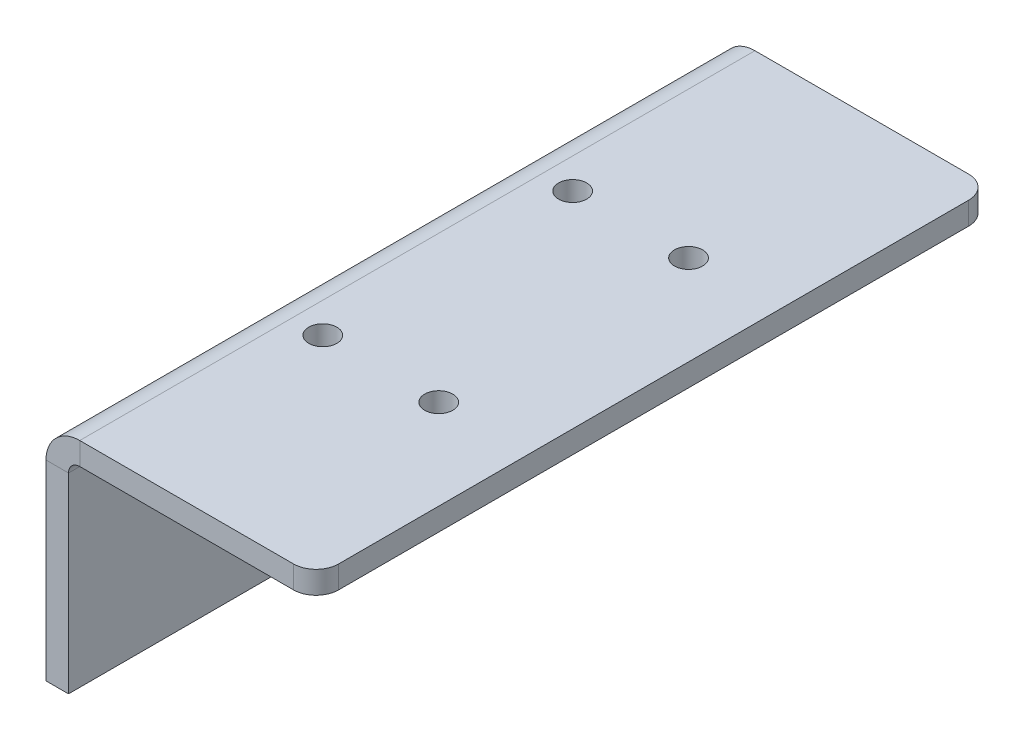
ISO-10303-21;
HEADER;
FILE_DESCRIPTION(('STEP AP214'),'2;1');
FILE_NAME('part.step','',(''),(''),'','','');
FILE_SCHEMA(('AUTOMOTIVE_DESIGN { 1 0 10303 214 1 1 1 1 }'));
ENDSEC;
DATA;
#1=APPLICATION_CONTEXT('core data for automotive mechanical design processes');
#2=APPLICATION_PROTOCOL_DEFINITION('international standard','automotive_design',2000,#1);
#3=PRODUCT_CONTEXT('',#1,'mechanical');
#4=PRODUCT('Part','Part','',(#3));
#5=PRODUCT_RELATED_PRODUCT_CATEGORY('part','',(#4));
#6=PRODUCT_DEFINITION_FORMATION('','',#4);
#7=PRODUCT_DEFINITION_CONTEXT('part definition',#1,'design');
#8=PRODUCT_DEFINITION('design','',#6,#7);
#9=PRODUCT_DEFINITION_SHAPE('','',#8);
#10=(LENGTH_UNIT() NAMED_UNIT(*) SI_UNIT(.MILLI.,.METRE.));
#11=(NAMED_UNIT(*) PLANE_ANGLE_UNIT() SI_UNIT($,.RADIAN.));
#12=(NAMED_UNIT(*) SI_UNIT($,.STERADIAN.) SOLID_ANGLE_UNIT());
#13=UNCERTAINTY_MEASURE_WITH_UNIT(LENGTH_MEASURE(1.E-05),#10,'distance_accuracy_value','');
#14=(GEOMETRIC_REPRESENTATION_CONTEXT(3) GLOBAL_UNCERTAINTY_ASSIGNED_CONTEXT((#13)) GLOBAL_UNIT_ASSIGNED_CONTEXT((#10,
#11,#12)) REPRESENTATION_CONTEXT('',''));
#15=CARTESIAN_POINT('',(0.,0.,0.));
#16=DIRECTION('',(0.,0.,1.));
#17=DIRECTION('',(1.,0.,0.));
#18=AXIS2_PLACEMENT_3D('',#15,#16,#17);
#19=CARTESIAN_POINT('',(-1042.27630537865,-730.,-340.));
#20=DIRECTION('',(0.,1.,0.));
#21=DIRECTION('',(-1.,0.,0.));
#22=AXIS2_PLACEMENT_3D('',#19,#20,#21);
#23=PLANE('',#22);
#24=DIRECTION('',(-1.,0.,0.));
#25=VECTOR('',#24,1.);
#26=CARTESIAN_POINT('',(-1042.27630537865,-730.,-340.));
#27=LINE('',#26,#25);
#28=CARTESIAN_POINT('',(-1165.,-730.000000000001,-340.));
#29=VERTEX_POINT('',#28);
#30=CARTESIAN_POINT('',(-1167.,-730.000000000001,-340.));
#31=VERTEX_POINT('',#30);
#32=EDGE_CURVE('E158',#29,#31,#27,.T.);
#33=ORIENTED_EDGE('',*,*,#32,.T.);
#34=DIRECTION('',(0.,0.,1.));
#35=VECTOR('',#34,1.);
#36=CARTESIAN_POINT('',(-1167.,-730.000000000001,-370.));
#37=LINE('',#36,#35);
#38=CARTESIAN_POINT('',(-1167.,-730.000000000001,-400.));
#39=VERTEX_POINT('',#38);
#40=EDGE_CURVE('E148',#31,#39,#37,.F.);
#41=ORIENTED_EDGE('',*,*,#40,.T.);
#42=DIRECTION('',(-1.,0.,0.));
#43=VECTOR('',#42,1.);
#44=CARTESIAN_POINT('',(-1042.27630537865,-730.,-400.));
#45=LINE('',#44,#43);
#46=CARTESIAN_POINT('',(-1165.,-730.000000000001,-400.));
#47=VERTEX_POINT('',#46);
#48=EDGE_CURVE('E239',#47,#39,#45,.T.);
#49=ORIENTED_EDGE('',*,*,#48,.F.);
#50=DIRECTION('',(0.,0.,1.));
#51=VECTOR('',#50,1.);
#52=CARTESIAN_POINT('',(-1165.,-730.000000000001,-340.));
#53=LINE('',#52,#51);
#54=EDGE_CURVE('E11',#29,#47,#53,.F.);
#55=ORIENTED_EDGE('',*,*,#54,.F.);
#56=EDGE_LOOP('',(#33,#41,#49,#55));
#57=FACE_BOUND('',#56,.T.);
#58=ADVANCED_FACE('F42',(#57),#23,.F.);
#59=CARTESIAN_POINT('',(-1042.27630537865,-712.,-340.));
#60=DIRECTION('',(0.,0.,1.));
#61=DIRECTION('',(1.,0.,0.));
#62=AXIS2_PLACEMENT_3D('',#59,#60,#61);
#63=PLANE('',#62);
#64=DIRECTION('',(0.,1.,0.));
#65=VECTOR('',#64,1.);
#66=CARTESIAN_POINT('',(-1167.,-712.000000000001,-340.));
#67=LINE('',#66,#65);
#68=CARTESIAN_POINT('',(-1167.,-713.000000000001,-340.));
#69=VERTEX_POINT('',#68);
#70=EDGE_CURVE('E139',#69,#31,#67,.F.);
#71=ORIENTED_EDGE('',*,*,#70,.T.);
#72=ORIENTED_EDGE('',*,*,#32,.F.);
#73=DIRECTION('',(0.,1.,0.));
#74=VECTOR('',#73,1.);
#75=CARTESIAN_POINT('',(-1165.,-712.000000000001,-340.));
#76=LINE('',#75,#74);
#77=CARTESIAN_POINT('',(-1165.,-713.000000000001,-340.));
#78=VERTEX_POINT('',#77);
#79=EDGE_CURVE('E86',#29,#78,#76,.T.);
#80=ORIENTED_EDGE('',*,*,#79,.T.);
#81=DIRECTION('',(-1.,0.,0.));
#82=VECTOR('',#81,1.);
#83=CARTESIAN_POINT('',(-1042.27630537865,-713.000000000001,-340.));
#84=LINE('',#83,#82);
#85=EDGE_CURVE('E136',#78,#69,#84,.T.);
#86=ORIENTED_EDGE('',*,*,#85,.T.);
#87=EDGE_LOOP('',(#71,#72,#80,#86));
#88=FACE_BOUND('',#87,.T.);
#89=ADVANCED_FACE('F138',(#88),#63,.T.);
#90=CARTESIAN_POINT('',(-1167.,-710.000000000001,-370.));
#91=DIRECTION('',(1.,0.,0.));
#92=DIRECTION('',(0.,1.,0.));
#93=AXIS2_PLACEMENT_3D('',#90,#91,#92);
#94=PLANE('',#93);
#95=ORIENTED_EDGE('',*,*,#40,.F.);
#96=ORIENTED_EDGE('',*,*,#70,.F.);
#97=DIRECTION('',(0.,0.,-1.));
#98=VECTOR('',#97,1.);
#99=CARTESIAN_POINT('',(-1167.,-713.000000000001,-400.));
#100=LINE('',#99,#98);
#101=CARTESIAN_POINT('',(-1167.,-713.000000000001,-400.));
#102=VERTEX_POINT('',#101);
#103=EDGE_CURVE('E147',#102,#69,#100,.F.);
#104=ORIENTED_EDGE('',*,*,#103,.F.);
#105=DIRECTION('',(0.,1.,0.));
#106=VECTOR('',#105,1.);
#107=CARTESIAN_POINT('',(-1167.,-712.000000000001,-400.));
#108=LINE('',#107,#106);
#109=EDGE_CURVE('E61',#39,#102,#108,.T.);
#110=ORIENTED_EDGE('',*,*,#109,.F.);
#111=EDGE_LOOP('',(#95,#96,#104,#110));
#112=FACE_BOUND('',#111,.T.);
#113=ADVANCED_FACE('F146',(#112),#94,.F.);
#114=CARTESIAN_POINT('',(-1042.27630537865,-712.,-400.));
#115=DIRECTION('',(0.,0.,-1.));
#116=DIRECTION('',(-1.,0.,0.));
#117=AXIS2_PLACEMENT_3D('',#114,#115,#116);
#118=PLANE('',#117);
#119=ORIENTED_EDGE('',*,*,#109,.T.);
#120=DIRECTION('',(-1.,0.,0.));
#121=VECTOR('',#120,1.);
#122=CARTESIAN_POINT('',(-1042.27630537865,-713.000000000001,-400.));
#123=LINE('',#122,#121);
#124=CARTESIAN_POINT('',(-1165.,-713.000000000001,-400.));
#125=VERTEX_POINT('',#124);
#126=EDGE_CURVE('E46',#125,#102,#123,.T.);
#127=ORIENTED_EDGE('',*,*,#126,.F.);
#128=DIRECTION('',(0.,1.,0.));
#129=VECTOR('',#128,1.);
#130=CARTESIAN_POINT('',(-1165.,-712.000000000001,-400.));
#131=LINE('',#130,#129);
#132=EDGE_CURVE('E242',#125,#47,#131,.F.);
#133=ORIENTED_EDGE('',*,*,#132,.T.);
#134=ORIENTED_EDGE('',*,*,#48,.T.);
#135=EDGE_LOOP('',(#119,#127,#133,#134));
#136=FACE_BOUND('',#135,.T.);
#137=ADVANCED_FACE('F291',(#136),#118,.T.);
#138=CARTESIAN_POINT('',(-1165.,-710.000000000001,-370.));
#139=DIRECTION('',(1.,0.,0.));
#140=DIRECTION('',(0.,1.,0.));
#141=AXIS2_PLACEMENT_3D('',#138,#139,#140);
#142=PLANE('',#141);
#143=ORIENTED_EDGE('',*,*,#132,.F.);
#144=DIRECTION('',(0.,0.,-1.));
#145=VECTOR('',#144,1.);
#146=CARTESIAN_POINT('',(-1165.,-713.000000000001,-400.));
#147=LINE('',#146,#145);
#148=EDGE_CURVE('E52',#125,#78,#147,.F.);
#149=ORIENTED_EDGE('',*,*,#148,.T.);
#150=ORIENTED_EDGE('',*,*,#79,.F.);
#151=ORIENTED_EDGE('',*,*,#54,.T.);
#152=EDGE_LOOP('',(#143,#149,#150,#151));
#153=FACE_BOUND('',#152,.T.);
#154=ADVANCED_FACE('F44',(#153),#142,.T.);
#155=CARTESIAN_POINT('',(-1151.,-710.000000000001,-358.9));
#156=DIRECTION('',(0.,1.,0.));
#157=DIRECTION('',(-1.,0.,0.));
#158=AXIS2_PLACEMENT_3D('',#155,#156,#157);
#159=CYLINDRICAL_SURFACE('',#158,1.24999999999997);
#160=CARTESIAN_POINT('',(-1151.,-710.000000000001,-358.9));
#161=DIRECTION('',(0.,1.,0.));
#162=DIRECTION('',(-1.,0.,0.));
#163=AXIS2_PLACEMENT_3D('',#160,#161,#162);
#164=CIRCLE('',#163,1.24999999999997);
#165=CARTESIAN_POINT('',(-1152.25,-710.000000000001,-358.9));
#166=VERTEX_POINT('',#165);
#167=EDGE_CURVE('E204',#166,#166,#164,.F.);
#168=ORIENTED_EDGE('',*,*,#167,.F.);
#169=EDGE_LOOP('',(#168));
#170=FACE_BOUND('',#169,.T.);
#171=CARTESIAN_POINT('',(-1151.,-712.000000000001,-358.9));
#172=DIRECTION('',(0.,1.,0.));
#173=DIRECTION('',(-1.,0.,0.));
#174=AXIS2_PLACEMENT_3D('',#171,#172,#173);
#175=CIRCLE('',#174,1.24999999999997);
#176=CARTESIAN_POINT('',(-1152.25,-712.000000000001,-358.9));
#177=VERTEX_POINT('',#176);
#178=EDGE_CURVE('E178',#177,#177,#175,.T.);
#179=ORIENTED_EDGE('',*,*,#178,.F.);
#180=EDGE_LOOP('',(#179));
#181=FACE_BOUND('',#180,.T.);
#182=ADVANCED_FACE('F296',(#170,#181),#159,.F.);
#183=CARTESIAN_POINT('',(-1161.3,-710.000000000001,-381.1));
#184=DIRECTION('',(0.,1.,0.));
#185=DIRECTION('',(-1.,0.,0.));
#186=AXIS2_PLACEMENT_3D('',#183,#184,#185);
#187=CYLINDRICAL_SURFACE('',#186,1.24999999999997);
#188=CARTESIAN_POINT('',(-1161.3,-710.000000000001,-381.1));
#189=DIRECTION('',(0.,1.,0.));
#190=DIRECTION('',(-1.,0.,0.));
#191=AXIS2_PLACEMENT_3D('',#188,#189,#190);
#192=CIRCLE('',#191,1.24999999999997);
#193=CARTESIAN_POINT('',(-1162.55,-710.000000000001,-381.1));
#194=VERTEX_POINT('',#193);
#195=EDGE_CURVE('E201',#194,#194,#192,.F.);
#196=ORIENTED_EDGE('',*,*,#195,.F.);
#197=EDGE_LOOP('',(#196));
#198=FACE_BOUND('',#197,.T.);
#199=CARTESIAN_POINT('',(-1161.3,-712.000000000001,-381.1));
#200=DIRECTION('',(0.,1.,0.));
#201=DIRECTION('',(-1.,0.,0.));
#202=AXIS2_PLACEMENT_3D('',#199,#200,#201);
#203=CIRCLE('',#202,1.24999999999997);
#204=CARTESIAN_POINT('',(-1162.55,-712.000000000001,-381.1));
#205=VERTEX_POINT('',#204);
#206=EDGE_CURVE('E175',#205,#205,#203,.T.);
#207=ORIENTED_EDGE('',*,*,#206,.F.);
#208=EDGE_LOOP('',(#207));
#209=FACE_BOUND('',#208,.T.);
#210=ADVANCED_FACE('F300',(#198,#209),#187,.F.);
#211=CARTESIAN_POINT('',(-1151.,-710.000000000001,-381.1));
#212=DIRECTION('',(0.,1.,0.));
#213=DIRECTION('',(-1.,0.,0.));
#214=AXIS2_PLACEMENT_3D('',#211,#212,#213);
#215=CYLINDRICAL_SURFACE('',#214,1.24999999999997);
#216=CARTESIAN_POINT('',(-1151.,-710.000000000001,-381.1));
#217=DIRECTION('',(0.,1.,0.));
#218=DIRECTION('',(-1.,0.,0.));
#219=AXIS2_PLACEMENT_3D('',#216,#217,#218);
#220=CIRCLE('',#219,1.24999999999997);
#221=CARTESIAN_POINT('',(-1152.25,-710.000000000001,-381.1));
#222=VERTEX_POINT('',#221);
#223=EDGE_CURVE('E198',#222,#222,#220,.F.);
#224=ORIENTED_EDGE('',*,*,#223,.F.);
#225=EDGE_LOOP('',(#224));
#226=FACE_BOUND('',#225,.T.);
#227=CARTESIAN_POINT('',(-1151.,-712.000000000001,-381.1));
#228=DIRECTION('',(0.,1.,0.));
#229=DIRECTION('',(-1.,0.,0.));
#230=AXIS2_PLACEMENT_3D('',#227,#228,#229);
#231=CIRCLE('',#230,1.24999999999997);
#232=CARTESIAN_POINT('',(-1152.25,-712.000000000001,-381.1));
#233=VERTEX_POINT('',#232);
#234=EDGE_CURVE('E172',#233,#233,#231,.T.);
#235=ORIENTED_EDGE('',*,*,#234,.F.);
#236=EDGE_LOOP('',(#235));
#237=FACE_BOUND('',#236,.T.);
#238=ADVANCED_FACE('F305',(#226,#237),#215,.F.);
#239=CARTESIAN_POINT('',(-1154.,-710.000000000001,-370.));
#240=DIRECTION('',(0.,-1.,0.));
#241=DIRECTION('',(1.,0.,0.));
#242=AXIS2_PLACEMENT_3D('',#239,#240,#241);
#243=PLANE('',#242);
#244=CARTESIAN_POINT('',(-1161.3,-710.000000000001,-358.9));
#245=DIRECTION('',(0.,1.,0.));
#246=DIRECTION('',(-1.,0.,0.));
#247=AXIS2_PLACEMENT_3D('',#244,#245,#246);
#248=CIRCLE('',#247,1.24999999999997);
#249=CARTESIAN_POINT('',(-1162.55,-710.000000000001,-358.9));
#250=VERTEX_POINT('',#249);
#251=EDGE_CURVE('E195',#250,#250,#248,.F.);
#252=ORIENTED_EDGE('',*,*,#251,.T.);
#253=EDGE_LOOP('',(#252));
#254=FACE_BOUND('',#253,.T.);
#255=ORIENTED_EDGE('',*,*,#223,.T.);
#256=EDGE_LOOP('',(#255));
#257=FACE_BOUND('',#256,.T.);
#258=ORIENTED_EDGE('',*,*,#195,.T.);
#259=EDGE_LOOP('',(#258));
#260=FACE_BOUND('',#259,.T.);
#261=ORIENTED_EDGE('',*,*,#167,.T.);
#262=EDGE_LOOP('',(#261));
#263=FACE_BOUND('',#262,.T.);
#264=DIRECTION('',(-1.,0.,0.));
#265=VECTOR('',#264,1.);
#266=CARTESIAN_POINT('',(-1143.,-710.000000000001,-400.));
#267=LINE('',#266,#265);
#268=CARTESIAN_POINT('',(-1164.,-710.000000000001,-400.));
#269=VERTEX_POINT('',#268);
#270=CARTESIAN_POINT('',(-1145.,-710.000000000001,-400.));
#271=VERTEX_POINT('',#270);
#272=EDGE_CURVE('E207',#269,#271,#267,.F.);
#273=ORIENTED_EDGE('',*,*,#272,.F.);
#274=DIRECTION('',(0.,0.,1.));
#275=VECTOR('',#274,1.);
#276=CARTESIAN_POINT('',(-1164.,-710.000000000001,-370.));
#277=LINE('',#276,#275);
#278=CARTESIAN_POINT('',(-1164.,-710.000000000001,-340.));
#279=VERTEX_POINT('',#278);
#280=EDGE_CURVE('E210',#279,#269,#277,.F.);
#281=ORIENTED_EDGE('',*,*,#280,.F.);
#282=DIRECTION('',(1.,0.,0.));
#283=VECTOR('',#282,1.);
#284=CARTESIAN_POINT('',(-1143.,-710.000000000001,-340.));
#285=LINE('',#284,#283);
#286=CARTESIAN_POINT('',(-1145.,-710.000000000001,-340.));
#287=VERTEX_POINT('',#286);
#288=EDGE_CURVE('E212',#287,#279,#285,.F.);
#289=ORIENTED_EDGE('',*,*,#288,.F.);
#290=CARTESIAN_POINT('',(-1145.,-710.000000000001,-342.));
#291=DIRECTION('',(0.,1.,0.));
#292=DIRECTION('',(-1.,0.,0.));
#293=AXIS2_PLACEMENT_3D('',#290,#291,#292);
#294=CIRCLE('',#293,2.);
#295=CARTESIAN_POINT('',(-1143.,-710.000000000001,-342.));
#296=VERTEX_POINT('',#295);
#297=EDGE_CURVE('E215',#296,#287,#294,.F.);
#298=ORIENTED_EDGE('',*,*,#297,.F.);
#299=DIRECTION('',(0.,0.,1.));
#300=VECTOR('',#299,1.);
#301=CARTESIAN_POINT('',(-1143.,-710.000000000001,-340.));
#302=LINE('',#301,#300);
#303=CARTESIAN_POINT('',(-1143.,-710.000000000001,-398.));
#304=VERTEX_POINT('',#303);
#305=EDGE_CURVE('E218',#304,#296,#302,.T.);
#306=ORIENTED_EDGE('',*,*,#305,.F.);
#307=CARTESIAN_POINT('',(-1145.,-710.000000000001,-398.));
#308=DIRECTION('',(0.,1.,0.));
#309=DIRECTION('',(-1.,0.,0.));
#310=AXIS2_PLACEMENT_3D('',#307,#308,#309);
#311=CIRCLE('',#310,2.);
#312=EDGE_CURVE('E221',#271,#304,#311,.F.);
#313=ORIENTED_EDGE('',*,*,#312,.F.);
#314=EDGE_LOOP('',(#273,#281,#289,#298,#306,#313));
#315=FACE_BOUND('',#314,.T.);
#316=ADVANCED_FACE('F265',(#254,#257,#260,#263,#315),#243,.F.);
#317=CARTESIAN_POINT('',(-1161.3,-710.000000000001,-358.9));
#318=DIRECTION('',(0.,1.,0.));
#319=DIRECTION('',(-1.,0.,0.));
#320=AXIS2_PLACEMENT_3D('',#317,#318,#319);
#321=CYLINDRICAL_SURFACE('',#320,1.24999999999997);
#322=ORIENTED_EDGE('',*,*,#251,.F.);
#323=EDGE_LOOP('',(#322));
#324=FACE_BOUND('',#323,.T.);
#325=CARTESIAN_POINT('',(-1161.3,-712.000000000001,-358.9));
#326=DIRECTION('',(0.,1.,0.));
#327=DIRECTION('',(-1.,0.,0.));
#328=AXIS2_PLACEMENT_3D('',#325,#326,#327);
#329=CIRCLE('',#328,1.24999999999997);
#330=CARTESIAN_POINT('',(-1162.55,-712.000000000001,-358.9));
#331=VERTEX_POINT('',#330);
#332=EDGE_CURVE('E163',#331,#331,#329,.T.);
#333=ORIENTED_EDGE('',*,*,#332,.F.);
#334=EDGE_LOOP('',(#333));
#335=FACE_BOUND('',#334,.T.);
#336=ADVANCED_FACE('F316',(#324,#335),#321,.F.);
#337=CARTESIAN_POINT('',(-1154.,-712.000000000001,-370.));
#338=DIRECTION('',(0.,-1.,0.));
#339=DIRECTION('',(1.,0.,0.));
#340=AXIS2_PLACEMENT_3D('',#337,#338,#339);
#341=PLANE('',#340);
#342=ORIENTED_EDGE('',*,*,#332,.T.);
#343=EDGE_LOOP('',(#342));
#344=FACE_BOUND('',#343,.T.);
#345=ORIENTED_EDGE('',*,*,#234,.T.);
#346=EDGE_LOOP('',(#345));
#347=FACE_BOUND('',#346,.T.);
#348=ORIENTED_EDGE('',*,*,#206,.T.);
#349=EDGE_LOOP('',(#348));
#350=FACE_BOUND('',#349,.T.);
#351=ORIENTED_EDGE('',*,*,#178,.T.);
#352=EDGE_LOOP('',(#351));
#353=FACE_BOUND('',#352,.T.);
#354=DIRECTION('',(0.,0.,1.));
#355=VECTOR('',#354,1.);
#356=CARTESIAN_POINT('',(-1143.,-712.000000000001,-370.));
#357=LINE('',#356,#355);
#358=CARTESIAN_POINT('',(-1143.,-712.000000000001,-398.));
#359=VERTEX_POINT('',#358);
#360=CARTESIAN_POINT('',(-1143.,-712.000000000001,-342.));
#361=VERTEX_POINT('',#360);
#362=EDGE_CURVE('E181',#359,#361,#357,.T.);
#363=ORIENTED_EDGE('',*,*,#362,.T.);
#364=CARTESIAN_POINT('',(-1145.,-712.000000000001,-342.));
#365=DIRECTION('',(0.,1.,0.));
#366=DIRECTION('',(-1.,0.,0.));
#367=AXIS2_PLACEMENT_3D('',#364,#365,#366);
#368=CIRCLE('',#367,2.);
#369=CARTESIAN_POINT('',(-1145.,-712.000000000001,-340.));
#370=VERTEX_POINT('',#369);
#371=EDGE_CURVE('E94',#361,#370,#368,.F.);
#372=ORIENTED_EDGE('',*,*,#371,.T.);
#373=DIRECTION('',(1.,0.,0.));
#374=VECTOR('',#373,1.);
#375=CARTESIAN_POINT('',(-1154.,-712.000000000001,-340.));
#376=LINE('',#375,#374);
#377=CARTESIAN_POINT('',(-1164.,-712.000000000001,-340.));
#378=VERTEX_POINT('',#377);
#379=EDGE_CURVE('E102',#370,#378,#376,.F.);
#380=ORIENTED_EDGE('',*,*,#379,.T.);
#381=DIRECTION('',(0.,0.,1.));
#382=VECTOR('',#381,1.);
#383=CARTESIAN_POINT('',(-1164.,-712.000000000001,-370.));
#384=LINE('',#383,#382);
#385=CARTESIAN_POINT('',(-1164.,-712.000000000001,-400.));
#386=VERTEX_POINT('',#385);
#387=EDGE_CURVE('E186',#378,#386,#384,.F.);
#388=ORIENTED_EDGE('',*,*,#387,.T.);
#389=DIRECTION('',(1.,0.,0.));
#390=VECTOR('',#389,1.);
#391=CARTESIAN_POINT('',(-1154.,-712.000000000001,-400.));
#392=LINE('',#391,#390);
#393=CARTESIAN_POINT('',(-1145.,-712.000000000001,-400.));
#394=VERTEX_POINT('',#393);
#395=EDGE_CURVE('E189',#386,#394,#392,.T.);
#396=ORIENTED_EDGE('',*,*,#395,.T.);
#397=CARTESIAN_POINT('',(-1145.,-712.000000000001,-398.));
#398=DIRECTION('',(0.,1.,0.));
#399=DIRECTION('',(-1.,0.,0.));
#400=AXIS2_PLACEMENT_3D('',#397,#398,#399);
#401=CIRCLE('',#400,2.);
#402=EDGE_CURVE('E192',#394,#359,#401,.F.);
#403=ORIENTED_EDGE('',*,*,#402,.T.);
#404=EDGE_LOOP('',(#363,#372,#380,#388,#396,#403));
#405=FACE_BOUND('',#404,.T.);
#406=ADVANCED_FACE('F261',(#344,#347,#350,#353,#405),#341,.T.);
#407=CARTESIAN_POINT('',(-1143.,-837.137720602503,-370.));
#408=DIRECTION('',(-1.,0.,0.));
#409=DIRECTION('',(0.,-1.,0.));
#410=AXIS2_PLACEMENT_3D('',#407,#408,#409);
#411=PLANE('',#410);
#412=DIRECTION('',(0.,1.,0.));
#413=VECTOR('',#412,1.);
#414=CARTESIAN_POINT('',(-1143.,-837.137720602503,-398.));
#415=LINE('',#414,#413);
#416=EDGE_CURVE('E224',#359,#304,#415,.T.);
#417=ORIENTED_EDGE('',*,*,#416,.T.);
#418=ORIENTED_EDGE('',*,*,#305,.T.);
#419=DIRECTION('',(0.,1.,0.));
#420=VECTOR('',#419,1.);
#421=CARTESIAN_POINT('',(-1143.,-837.137720602503,-342.));
#422=LINE('',#421,#420);
#423=EDGE_CURVE('E236',#361,#296,#422,.T.);
#424=ORIENTED_EDGE('',*,*,#423,.F.);
#425=ORIENTED_EDGE('',*,*,#362,.F.);
#426=EDGE_LOOP('',(#417,#418,#424,#425));
#427=FACE_BOUND('',#426,.T.);
#428=ADVANCED_FACE('F269',(#427),#411,.F.);
#429=CARTESIAN_POINT('',(-1145.,-837.137720602503,-342.));
#430=DIRECTION('',(0.,1.,0.));
#431=DIRECTION('',(-1.,0.,0.));
#432=AXIS2_PLACEMENT_3D('',#429,#430,#431);
#433=CYLINDRICAL_SURFACE('',#432,2.);
#434=ORIENTED_EDGE('',*,*,#423,.T.);
#435=ORIENTED_EDGE('',*,*,#297,.T.);
#436=DIRECTION('',(0.,1.,0.));
#437=VECTOR('',#436,1.);
#438=CARTESIAN_POINT('',(-1145.,-837.137720602503,-340.));
#439=LINE('',#438,#437);
#440=EDGE_CURVE('E234',#370,#287,#439,.T.);
#441=ORIENTED_EDGE('',*,*,#440,.F.);
#442=ORIENTED_EDGE('',*,*,#371,.F.);
#443=EDGE_LOOP('',(#434,#435,#441,#442));
#444=FACE_BOUND('',#443,.T.);
#445=ADVANCED_FACE('F266',(#444),#433,.T.);
#446=CARTESIAN_POINT('',(-1154.,-837.137720602503,-340.));
#447=DIRECTION('',(0.,0.,-1.));
#448=DIRECTION('',(0.,1.,0.));
#449=AXIS2_PLACEMENT_3D('',#446,#447,#448);
#450=PLANE('',#449);
#451=ORIENTED_EDGE('',*,*,#440,.T.);
#452=ORIENTED_EDGE('',*,*,#288,.T.);
#453=DIRECTION('',(0.,1.,0.));
#454=VECTOR('',#453,1.);
#455=CARTESIAN_POINT('',(-1164.,-837.137720602503,-340.));
#456=LINE('',#455,#454);
#457=EDGE_CURVE('E160',#378,#279,#456,.T.);
#458=ORIENTED_EDGE('',*,*,#457,.F.);
#459=ORIENTED_EDGE('',*,*,#379,.F.);
#460=EDGE_LOOP('',(#451,#452,#458,#459));
#461=FACE_BOUND('',#460,.T.);
#462=ADVANCED_FACE('F262',(#461),#450,.F.);
#463=CARTESIAN_POINT('',(-1154.,-837.137720602503,-400.));
#464=DIRECTION('',(0.,0.,1.));
#465=DIRECTION('',(0.,-1.,0.));
#466=AXIS2_PLACEMENT_3D('',#463,#464,#465);
#467=PLANE('',#466);
#468=DIRECTION('',(0.,1.,0.));
#469=VECTOR('',#468,1.);
#470=CARTESIAN_POINT('',(-1164.,-837.137720602503,-400.));
#471=LINE('',#470,#469);
#472=EDGE_CURVE('E230',#386,#269,#471,.T.);
#473=ORIENTED_EDGE('',*,*,#472,.T.);
#474=ORIENTED_EDGE('',*,*,#272,.T.);
#475=DIRECTION('',(0.,1.,0.));
#476=VECTOR('',#475,1.);
#477=CARTESIAN_POINT('',(-1145.,-837.137720602503,-400.));
#478=LINE('',#477,#476);
#479=EDGE_CURVE('E227',#394,#271,#478,.T.);
#480=ORIENTED_EDGE('',*,*,#479,.F.);
#481=ORIENTED_EDGE('',*,*,#395,.F.);
#482=EDGE_LOOP('',(#473,#474,#480,#481));
#483=FACE_BOUND('',#482,.T.);
#484=ADVANCED_FACE('F259',(#483),#467,.F.);
#485=CARTESIAN_POINT('',(-1145.,-837.137720602503,-398.));
#486=DIRECTION('',(0.,1.,0.));
#487=DIRECTION('',(-1.,0.,0.));
#488=AXIS2_PLACEMENT_3D('',#485,#486,#487);
#489=CYLINDRICAL_SURFACE('',#488,2.);
#490=ORIENTED_EDGE('',*,*,#479,.T.);
#491=ORIENTED_EDGE('',*,*,#312,.T.);
#492=ORIENTED_EDGE('',*,*,#416,.F.);
#493=ORIENTED_EDGE('',*,*,#402,.F.);
#494=EDGE_LOOP('',(#490,#491,#492,#493));
#495=FACE_BOUND('',#494,.T.);
#496=ADVANCED_FACE('F271',(#495),#489,.T.);
#497=CARTESIAN_POINT('',(-1164.,-713.000000000001,-400.));
#498=DIRECTION('',(0.,0.,-1.));
#499=DIRECTION('',(-1.,0.,0.));
#500=AXIS2_PLACEMENT_3D('',#497,#498,#499);
#501=PLANE('',#500);
#502=ORIENTED_EDGE('',*,*,#472,.F.);
#503=CARTESIAN_POINT('',(-1164.,-713.000000000001,-400.));
#504=DIRECTION('',(0.,0.,-1.));
#505=DIRECTION('',(-1.,0.,0.));
#506=AXIS2_PLACEMENT_3D('',#503,#504,#505);
#507=CIRCLE('',#506,0.999999999999906);
#508=EDGE_CURVE('E161',#386,#125,#507,.F.);
#509=ORIENTED_EDGE('',*,*,#508,.T.);
#510=ORIENTED_EDGE('',*,*,#126,.T.);
#511=CARTESIAN_POINT('',(-1164.,-713.000000000001,-400.));
#512=DIRECTION('',(0.,0.,-1.));
#513=DIRECTION('',(-1.,0.,0.));
#514=AXIS2_PLACEMENT_3D('',#511,#512,#513);
#515=CIRCLE('',#514,2.99999999999991);
#516=EDGE_CURVE('E157',#269,#102,#515,.F.);
#517=ORIENTED_EDGE('',*,*,#516,.F.);
#518=EDGE_LOOP('',(#502,#509,#510,#517));
#519=FACE_BOUND('',#518,.T.);
#520=ADVANCED_FACE('F255',(#519),#501,.T.);
#521=CARTESIAN_POINT('',(-1164.,-713.000000000001,-340.));
#522=DIRECTION('',(0.,0.,1.));
#523=DIRECTION('',(1.,0.,0.));
#524=AXIS2_PLACEMENT_3D('',#521,#522,#523);
#525=PLANE('',#524);
#526=ORIENTED_EDGE('',*,*,#85,.F.);
#527=CARTESIAN_POINT('',(-1164.,-713.000000000001,-340.));
#528=DIRECTION('',(0.,0.,-1.));
#529=DIRECTION('',(-1.,0.,0.));
#530=AXIS2_PLACEMENT_3D('',#527,#528,#529);
#531=CIRCLE('',#530,0.999999999999906);
#532=EDGE_CURVE('E166',#78,#378,#531,.T.);
#533=ORIENTED_EDGE('',*,*,#532,.T.);
#534=ORIENTED_EDGE('',*,*,#457,.T.);
#535=CARTESIAN_POINT('',(-1164.,-713.000000000001,-340.));
#536=DIRECTION('',(0.,0.,-1.));
#537=DIRECTION('',(-1.,0.,0.));
#538=AXIS2_PLACEMENT_3D('',#535,#536,#537);
#539=CIRCLE('',#538,2.99999999999991);
#540=EDGE_CURVE('E155',#69,#279,#539,.T.);
#541=ORIENTED_EDGE('',*,*,#540,.F.);
#542=EDGE_LOOP('',(#526,#533,#534,#541));
#543=FACE_BOUND('',#542,.T.);
#544=ADVANCED_FACE('F159',(#543),#525,.T.);
#545=CARTESIAN_POINT('',(-1164.,-713.000000000001,-267.526832551627));
#546=DIRECTION('',(0.,0.,-1.));
#547=DIRECTION('',(-1.,0.,0.));
#548=AXIS2_PLACEMENT_3D('',#545,#546,#547);
#549=CYLINDRICAL_SURFACE('',#548,2.99999999999991);
#550=ORIENTED_EDGE('',*,*,#540,.T.);
#551=ORIENTED_EDGE('',*,*,#280,.T.);
#552=ORIENTED_EDGE('',*,*,#516,.T.);
#553=ORIENTED_EDGE('',*,*,#103,.T.);
#554=EDGE_LOOP('',(#550,#551,#552,#553));
#555=FACE_BOUND('',#554,.T.);
#556=ADVANCED_FACE('F153',(#555),#549,.T.);
#557=CARTESIAN_POINT('',(-1164.,-713.000000000001,-267.526832551627));
#558=DIRECTION('',(0.,0.,-1.));
#559=DIRECTION('',(-1.,0.,0.));
#560=AXIS2_PLACEMENT_3D('',#557,#558,#559);
#561=CYLINDRICAL_SURFACE('',#560,0.999999999999906);
#562=ORIENTED_EDGE('',*,*,#532,.F.);
#563=ORIENTED_EDGE('',*,*,#148,.F.);
#564=ORIENTED_EDGE('',*,*,#508,.F.);
#565=ORIENTED_EDGE('',*,*,#387,.F.);
#566=EDGE_LOOP('',(#562,#563,#564,#565));
#567=FACE_BOUND('',#566,.T.);
#568=ADVANCED_FACE('F251',(#567),#561,.F.);
#569=CLOSED_SHELL('',(#58,#89,#113,#137,#154,#182,#210,#238,#316,#336,#406,#428,#445,#462,#484,
#496,#520,#544,#556,#568));
#570=MANIFOLD_SOLID_BREP('B2',#569);
#571=ADVANCED_BREP_SHAPE_REPRESENTATION('',(#18,#570),#14);
#572=SHAPE_DEFINITION_REPRESENTATION(#9,#571);
ENDSEC;
END-ISO-10303-21;
